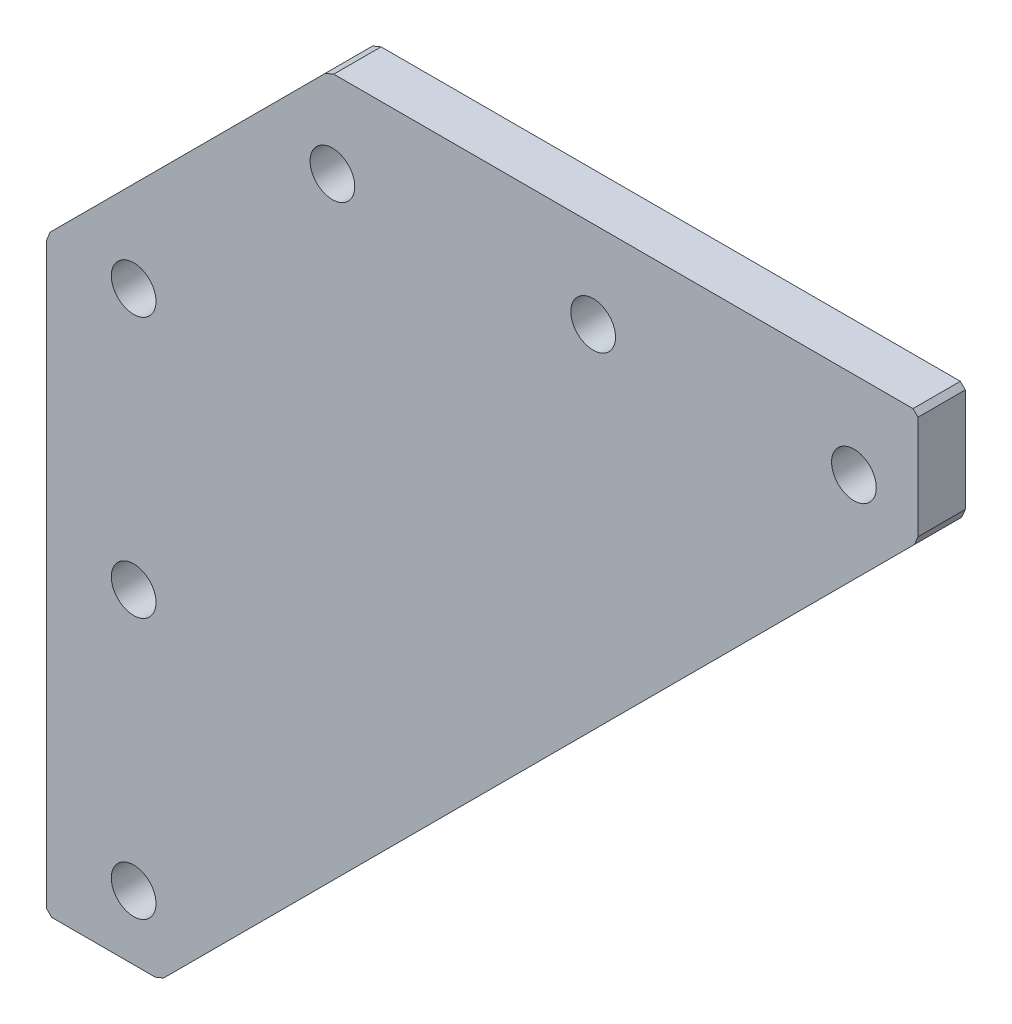
ISO-10303-21;
HEADER;
FILE_DESCRIPTION(('STEP AP214'),'2;1');
FILE_NAME('part.step','',(''),(''),'','','');
FILE_SCHEMA(('AUTOMOTIVE_DESIGN { 1 0 10303 214 1 1 1 1 }'));
ENDSEC;
DATA;
#1=APPLICATION_CONTEXT('core data for automotive mechanical design processes');
#2=APPLICATION_PROTOCOL_DEFINITION('international standard','automotive_design',2000,#1);
#3=PRODUCT_CONTEXT('',#1,'mechanical');
#4=PRODUCT('Part','Part','',(#3));
#5=PRODUCT_RELATED_PRODUCT_CATEGORY('part','',(#4));
#6=PRODUCT_DEFINITION_FORMATION('','',#4);
#7=PRODUCT_DEFINITION_CONTEXT('part definition',#1,'design');
#8=PRODUCT_DEFINITION('design','',#6,#7);
#9=PRODUCT_DEFINITION_SHAPE('','',#8);
#10=(LENGTH_UNIT() NAMED_UNIT(*) SI_UNIT(.MILLI.,.METRE.));
#11=(NAMED_UNIT(*) PLANE_ANGLE_UNIT() SI_UNIT($,.RADIAN.));
#12=(NAMED_UNIT(*) SI_UNIT($,.STERADIAN.) SOLID_ANGLE_UNIT());
#13=UNCERTAINTY_MEASURE_WITH_UNIT(LENGTH_MEASURE(1.E-05),#10,'distance_accuracy_value','');
#14=(GEOMETRIC_REPRESENTATION_CONTEXT(3) GLOBAL_UNCERTAINTY_ASSIGNED_CONTEXT((#13)) GLOBAL_UNIT_ASSIGNED_CONTEXT((#10,
#11,#12)) REPRESENTATION_CONTEXT('',''));
#15=CARTESIAN_POINT('',(0.,0.,0.));
#16=DIRECTION('',(0.,0.,1.));
#17=DIRECTION('',(1.,0.,0.));
#18=AXIS2_PLACEMENT_3D('',#15,#16,#17);
#19=CARTESIAN_POINT('',(157.849025766973,17.5000000000001,4.7625));
#20=DIRECTION('',(0.,-1.,0.));
#21=DIRECTION('',(1.,0.,0.));
#22=AXIS2_PLACEMENT_3D('',#19,#20,#21);
#23=PLANE('',#22);
#24=DIRECTION('',(-1.,0.,0.));
#25=VECTOR('',#24,1.);
#26=CARTESIAN_POINT('',(157.849025766973,17.5000000000001,4.7625));
#27=LINE('',#26,#25);
#28=CARTESIAN_POINT('',(156.849025766973,17.5000000000001,4.7625));
#29=VERTEX_POINT('',#28);
#30=CARTESIAN_POINT('',(40.2677669529665,17.5000000000001,4.7625));
#31=VERTEX_POINT('',#30);
#32=EDGE_CURVE('E146',#29,#31,#27,.T.);
#33=ORIENTED_EDGE('',*,*,#32,.F.);
#34=DIRECTION('',(0.,0.,-1.));
#35=VECTOR('',#34,1.);
#36=CARTESIAN_POINT('',(156.849025766973,17.5000000000001,4.7625));
#37=LINE('',#36,#35);
#38=CARTESIAN_POINT('',(156.849025766973,17.5000000000001,-4.7625));
#39=VERTEX_POINT('',#38);
#40=EDGE_CURVE('E131',#29,#39,#37,.T.);
#41=ORIENTED_EDGE('',*,*,#40,.T.);
#42=DIRECTION('',(-1.,0.,0.));
#43=VECTOR('',#42,1.);
#44=CARTESIAN_POINT('',(157.849025766973,17.5000000000001,-4.7625));
#45=LINE('',#44,#43);
#46=CARTESIAN_POINT('',(40.2677669529665,17.5000000000001,-4.7625));
#47=VERTEX_POINT('',#46);
#48=EDGE_CURVE('E143',#39,#47,#45,.T.);
#49=ORIENTED_EDGE('',*,*,#48,.T.);
#50=DIRECTION('',(0.,0.,1.));
#51=VECTOR('',#50,1.);
#52=CARTESIAN_POINT('',(40.2677669529665,17.5000000000001,4.7625));
#53=LINE('',#52,#51);
#54=EDGE_CURVE('E148',#47,#31,#53,.T.);
#55=ORIENTED_EDGE('',*,*,#54,.T.);
#56=EDGE_LOOP('',(#33,#41,#49,#55));
#57=FACE_BOUND('',#56,.T.);
#58=ADVANCED_FACE('F36',(#57),#23,.F.);
#59=CARTESIAN_POINT('',(-17.5,-39.2677669529664,4.7625));
#60=DIRECTION('',(0.707106781186548,-0.707106781186548,0.));
#61=DIRECTION('',(0.707106781186548,0.707106781186548,0.));
#62=AXIS2_PLACEMENT_3D('',#59,#60,#61);
#63=PLANE('',#62);
#64=DIRECTION('',(-0.707106781186548,-0.707106781186548,0.));
#65=VECTOR('',#64,1.);
#66=CARTESIAN_POINT('',(-17.5,-39.2677669529664,-4.7625));
#67=LINE('',#66,#65);
#68=CARTESIAN_POINT('',(38.5606601717798,16.7928932188135,-4.7625));
#69=VERTEX_POINT('',#68);
#70=CARTESIAN_POINT('',(-16.7928932188135,-38.5606601717799,-4.7625));
#71=VERTEX_POINT('',#70);
#72=EDGE_CURVE('E152',#69,#71,#67,.T.);
#73=ORIENTED_EDGE('',*,*,#72,.T.);
#74=DIRECTION('',(0.,0.,1.));
#75=VECTOR('',#74,1.);
#76=CARTESIAN_POINT('',(-16.7928932188135,-38.5606601717799,4.7625));
#77=LINE('',#76,#75);
#78=CARTESIAN_POINT('',(-16.7928932188135,-38.5606601717799,4.7625));
#79=VERTEX_POINT('',#78);
#80=EDGE_CURVE('E11',#71,#79,#77,.T.);
#81=ORIENTED_EDGE('',*,*,#80,.T.);
#82=DIRECTION('',(-0.707106781186548,-0.707106781186548,0.));
#83=VECTOR('',#82,1.);
#84=CARTESIAN_POINT('',(-17.5,-39.2677669529664,4.7625));
#85=LINE('',#84,#83);
#86=CARTESIAN_POINT('',(38.5606601717798,16.7928932188135,4.7625));
#87=VERTEX_POINT('',#86);
#88=EDGE_CURVE('E217',#87,#79,#85,.T.);
#89=ORIENTED_EDGE('',*,*,#88,.F.);
#90=DIRECTION('',(0.,0.,-1.));
#91=VECTOR('',#90,1.);
#92=CARTESIAN_POINT('',(38.5606601717798,16.7928932188135,4.7625));
#93=LINE('',#92,#91);
#94=EDGE_CURVE('E45',#87,#69,#93,.T.);
#95=ORIENTED_EDGE('',*,*,#94,.T.);
#96=EDGE_LOOP('',(#73,#81,#89,#95));
#97=FACE_BOUND('',#96,.T.);
#98=ADVANCED_FACE('F214',(#97),#63,.F.);
#99=CARTESIAN_POINT('',(-17.5,-39.2677669529664,4.7625));
#100=DIRECTION('',(1.,0.,0.));
#101=DIRECTION('',(0.,1.,0.));
#102=AXIS2_PLACEMENT_3D('',#99,#100,#101);
#103=PLANE('',#102);
#104=DIRECTION('',(0.,-1.,0.));
#105=VECTOR('',#104,1.);
#106=CARTESIAN_POINT('',(-17.5,-39.2677669529664,-4.7625));
#107=LINE('',#106,#105);
#108=CARTESIAN_POINT('',(-17.5,-40.2677669529663,-4.7625));
#109=VERTEX_POINT('',#108);
#110=CARTESIAN_POINT('',(-17.5,-156.849025766973,-4.7625));
#111=VERTEX_POINT('',#110);
#112=EDGE_CURVE('E156',#109,#111,#107,.T.);
#113=ORIENTED_EDGE('',*,*,#112,.T.);
#114=DIRECTION('',(0.,0.,1.));
#115=VECTOR('',#114,1.);
#116=CARTESIAN_POINT('',(-17.5,-156.849025766973,4.7625));
#117=LINE('',#116,#115);
#118=CARTESIAN_POINT('',(-17.5,-156.849025766973,4.7625));
#119=VERTEX_POINT('',#118);
#120=EDGE_CURVE('E205',#111,#119,#117,.T.);
#121=ORIENTED_EDGE('',*,*,#120,.T.);
#122=DIRECTION('',(0.,-1.,0.));
#123=VECTOR('',#122,1.);
#124=CARTESIAN_POINT('',(-17.5,-39.2677669529664,4.7625));
#125=LINE('',#124,#123);
#126=CARTESIAN_POINT('',(-17.5,-40.2677669529663,4.7625));
#127=VERTEX_POINT('',#126);
#128=EDGE_CURVE('E230',#127,#119,#125,.T.);
#129=ORIENTED_EDGE('',*,*,#128,.F.);
#130=DIRECTION('',(0.,0.,-1.));
#131=VECTOR('',#130,1.);
#132=CARTESIAN_POINT('',(-17.5,-40.2677669529663,4.7625));
#133=LINE('',#132,#131);
#134=EDGE_CURVE('E202',#127,#109,#133,.T.);
#135=ORIENTED_EDGE('',*,*,#134,.T.);
#136=EDGE_LOOP('',(#113,#121,#129,#135));
#137=FACE_BOUND('',#136,.T.);
#138=ADVANCED_FACE('F227',(#137),#103,.F.);
#139=CARTESIAN_POINT('',(-17.5,-157.849025766973,4.7625));
#140=DIRECTION('',(0.,1.,0.));
#141=DIRECTION('',(-1.,0.,0.));
#142=AXIS2_PLACEMENT_3D('',#139,#140,#141);
#143=PLANE('',#142);
#144=DIRECTION('',(1.,0.,0.));
#145=VECTOR('',#144,1.);
#146=CARTESIAN_POINT('',(-17.5,-157.849025766973,4.7625));
#147=LINE('',#146,#145);
#148=CARTESIAN_POINT('',(-16.5,-157.849025766973,4.7625));
#149=VERTEX_POINT('',#148);
#150=CARTESIAN_POINT('',(4.3400974233027,-157.849025766973,4.7625));
#151=VERTEX_POINT('',#150);
#152=EDGE_CURVE('E232',#149,#151,#147,.T.);
#153=ORIENTED_EDGE('',*,*,#152,.F.);
#154=DIRECTION('',(0.,0.,-1.));
#155=VECTOR('',#154,1.);
#156=CARTESIAN_POINT('',(-16.5,-157.849025766973,4.7625));
#157=LINE('',#156,#155);
#158=CARTESIAN_POINT('',(-16.5,-157.849025766973,-4.7625));
#159=VERTEX_POINT('',#158);
#160=EDGE_CURVE('E199',#149,#159,#157,.T.);
#161=ORIENTED_EDGE('',*,*,#160,.T.);
#162=DIRECTION('',(1.,0.,0.));
#163=VECTOR('',#162,1.);
#164=CARTESIAN_POINT('',(-17.5,-157.849025766973,-4.7625));
#165=LINE('',#164,#163);
#166=CARTESIAN_POINT('',(4.3400974233027,-157.849025766973,-4.7625));
#167=VERTEX_POINT('',#166);
#168=EDGE_CURVE('E167',#159,#167,#165,.T.);
#169=ORIENTED_EDGE('',*,*,#168,.T.);
#170=DIRECTION('',(0.,0.,1.));
#171=VECTOR('',#170,1.);
#172=CARTESIAN_POINT('',(4.3400974233027,-157.849025766973,4.7625));
#173=LINE('',#172,#171);
#174=EDGE_CURVE('E197',#167,#151,#173,.T.);
#175=ORIENTED_EDGE('',*,*,#174,.T.);
#176=EDGE_LOOP('',(#153,#161,#169,#175));
#177=FACE_BOUND('',#176,.T.);
#178=ADVANCED_FACE('F256',(#177),#143,.F.);
#179=CARTESIAN_POINT('',(5.34009742330267,-157.849025766973,4.7625));
#180=DIRECTION('',(-0.707106781186548,0.707106781186547,0.));
#181=DIRECTION('',(-0.707106781186547,-0.707106781186548,0.));
#182=AXIS2_PLACEMENT_3D('',#179,#180,#181);
#183=PLANE('',#182);
#184=DIRECTION('',(0.707106781186547,0.707106781186548,0.));
#185=VECTOR('',#184,1.);
#186=CARTESIAN_POINT('',(5.34009742330267,-157.849025766973,-4.7625));
#187=LINE('',#186,#185);
#188=CARTESIAN_POINT('',(6.04720420448925,-157.141918985787,-4.7625));
#189=VERTEX_POINT('',#188);
#190=CARTESIAN_POINT('',(157.141918985787,-6.0472042044892,-4.7625));
#191=VERTEX_POINT('',#190);
#192=EDGE_CURVE('E170',#189,#191,#187,.T.);
#193=ORIENTED_EDGE('',*,*,#192,.T.);
#194=DIRECTION('',(0.,0.,1.));
#195=VECTOR('',#194,1.);
#196=CARTESIAN_POINT('',(157.141918985787,-6.04720420448918,4.7625));
#197=LINE('',#196,#195);
#198=CARTESIAN_POINT('',(157.141918985787,-6.0472042044892,4.7625));
#199=VERTEX_POINT('',#198);
#200=EDGE_CURVE('E52',#191,#199,#197,.T.);
#201=ORIENTED_EDGE('',*,*,#200,.T.);
#202=DIRECTION('',(0.707106781186547,0.707106781186548,0.));
#203=VECTOR('',#202,1.);
#204=CARTESIAN_POINT('',(5.34009742330267,-157.849025766973,4.7625));
#205=LINE('',#204,#203);
#206=CARTESIAN_POINT('',(6.04720420448925,-157.141918985787,4.7625));
#207=VERTEX_POINT('',#206);
#208=EDGE_CURVE('E234',#207,#199,#205,.T.);
#209=ORIENTED_EDGE('',*,*,#208,.F.);
#210=DIRECTION('',(0.,0.,-1.));
#211=VECTOR('',#210,1.);
#212=CARTESIAN_POINT('',(6.04720420448925,-157.141918985787,4.7625));
#213=LINE('',#212,#211);
#214=EDGE_CURVE('E207',#207,#189,#213,.T.);
#215=ORIENTED_EDGE('',*,*,#214,.T.);
#216=EDGE_LOOP('',(#193,#201,#209,#215));
#217=FACE_BOUND('',#216,.T.);
#218=ADVANCED_FACE('F248',(#217),#183,.F.);
#219=CARTESIAN_POINT('',(157.849025766973,-5.34009742330262,4.7625));
#220=DIRECTION('',(-1.,0.,0.));
#221=DIRECTION('',(0.,-1.,0.));
#222=AXIS2_PLACEMENT_3D('',#219,#220,#221);
#223=PLANE('',#222);
#224=DIRECTION('',(0.,1.,0.));
#225=VECTOR('',#224,1.);
#226=CARTESIAN_POINT('',(157.849025766973,-5.34009742330262,-4.7625));
#227=LINE('',#226,#225);
#228=CARTESIAN_POINT('',(157.849025766973,-4.34009742330263,-4.7625));
#229=VERTEX_POINT('',#228);
#230=CARTESIAN_POINT('',(157.849025766973,16.5000000000001,-4.7625));
#231=VERTEX_POINT('',#230);
#232=EDGE_CURVE('E172',#229,#231,#227,.T.);
#233=ORIENTED_EDGE('',*,*,#232,.T.);
#234=DIRECTION('',(0.,0.,1.));
#235=VECTOR('',#234,1.);
#236=CARTESIAN_POINT('',(157.849025766973,16.5000000000001,4.7625));
#237=LINE('',#236,#235);
#238=CARTESIAN_POINT('',(157.849025766973,16.5000000000001,4.7625));
#239=VERTEX_POINT('',#238);
#240=EDGE_CURVE('E132',#231,#239,#237,.T.);
#241=ORIENTED_EDGE('',*,*,#240,.T.);
#242=DIRECTION('',(0.,1.,0.));
#243=VECTOR('',#242,1.);
#244=CARTESIAN_POINT('',(157.849025766973,-5.34009742330262,4.7625));
#245=LINE('',#244,#243);
#246=CARTESIAN_POINT('',(157.849025766973,-4.34009742330263,4.7625));
#247=VERTEX_POINT('',#246);
#248=EDGE_CURVE('E162',#247,#239,#245,.T.);
#249=ORIENTED_EDGE('',*,*,#248,.F.);
#250=DIRECTION('',(0.,0.,-1.));
#251=VECTOR('',#250,1.);
#252=CARTESIAN_POINT('',(157.849025766973,-4.34009742330263,4.7625));
#253=LINE('',#252,#251);
#254=EDGE_CURVE('E137',#247,#229,#253,.T.);
#255=ORIENTED_EDGE('',*,*,#254,.T.);
#256=EDGE_LOOP('',(#233,#241,#249,#255));
#257=FACE_BOUND('',#256,.T.);
#258=ADVANCED_FACE('F244',(#257),#223,.F.);
#259=CARTESIAN_POINT('',(0.,0.,4.7625));
#260=DIRECTION('',(0.,0.,1.));
#261=DIRECTION('',(1.,0.,0.));
#262=AXIS2_PLACEMENT_3D('',#259,#260,#261);
#263=PLANE('',#262);
#264=CARTESIAN_POINT('',(0.,-92.4784450716211,4.7625));
#265=DIRECTION('',(0.,0.,1.));
#266=DIRECTION('',(1.,0.,0.));
#267=AXIS2_PLACEMENT_3D('',#264,#265,#266);
#268=CIRCLE('',#267,4.5);
#269=CARTESIAN_POINT('',(4.5,-92.4784450716211,4.7625));
#270=VERTEX_POINT('',#269);
#271=EDGE_CURVE('E471',#270,#270,#268,.T.);
#272=ORIENTED_EDGE('',*,*,#271,.F.);
#273=EDGE_LOOP('',(#272));
#274=FACE_BOUND('',#273,.T.);
#275=CARTESIAN_POINT('',(144.956890143242,0.,4.7625));
#276=DIRECTION('',(0.,0.,1.));
#277=DIRECTION('',(1.,0.,0.));
#278=AXIS2_PLACEMENT_3D('',#275,#276,#277);
#279=CIRCLE('',#278,4.5);
#280=CARTESIAN_POINT('',(149.456890143242,0.,4.7625));
#281=VERTEX_POINT('',#280);
#282=EDGE_CURVE('E465',#281,#281,#279,.T.);
#283=ORIENTED_EDGE('',*,*,#282,.F.);
#284=EDGE_LOOP('',(#283));
#285=FACE_BOUND('',#284,.T.);
#286=CARTESIAN_POINT('',(92.4784450716211,0.,4.7625));
#287=DIRECTION('',(0.,0.,1.));
#288=DIRECTION('',(1.,0.,0.));
#289=AXIS2_PLACEMENT_3D('',#286,#287,#288);
#290=CIRCLE('',#289,4.5);
#291=CARTESIAN_POINT('',(96.9784450716211,0.,4.7625));
#292=VERTEX_POINT('',#291);
#293=EDGE_CURVE('E459',#292,#292,#290,.T.);
#294=ORIENTED_EDGE('',*,*,#293,.F.);
#295=EDGE_LOOP('',(#294));
#296=FACE_BOUND('',#295,.T.);
#297=CARTESIAN_POINT('',(0.,-40.,4.7625));
#298=DIRECTION('',(0.,0.,1.));
#299=DIRECTION('',(1.,0.,0.));
#300=AXIS2_PLACEMENT_3D('',#297,#298,#299);
#301=CIRCLE('',#300,4.5);
#302=CARTESIAN_POINT('',(4.5,-40.,4.7625));
#303=VERTEX_POINT('',#302);
#304=EDGE_CURVE('E453',#303,#303,#301,.T.);
#305=ORIENTED_EDGE('',*,*,#304,.F.);
#306=EDGE_LOOP('',(#305));
#307=FACE_BOUND('',#306,.T.);
#308=CARTESIAN_POINT('',(0.,-144.956890143242,4.7625));
#309=DIRECTION('',(0.,0.,1.));
#310=DIRECTION('',(1.,0.,0.));
#311=AXIS2_PLACEMENT_3D('',#308,#309,#310);
#312=CIRCLE('',#311,4.5);
#313=CARTESIAN_POINT('',(4.5,-144.956890143242,4.7625));
#314=VERTEX_POINT('',#313);
#315=EDGE_CURVE('E445',#314,#314,#312,.T.);
#316=ORIENTED_EDGE('',*,*,#315,.F.);
#317=EDGE_LOOP('',(#316));
#318=FACE_BOUND('',#317,.T.);
#319=CARTESIAN_POINT('',(40.,0.,4.7625));
#320=DIRECTION('',(0.,0.,1.));
#321=DIRECTION('',(1.,0.,0.));
#322=AXIS2_PLACEMENT_3D('',#319,#320,#321);
#323=CIRCLE('',#322,4.5);
#324=CARTESIAN_POINT('',(44.5,0.,4.7625));
#325=VERTEX_POINT('',#324);
#326=EDGE_CURVE('E159',#325,#325,#323,.T.);
#327=ORIENTED_EDGE('',*,*,#326,.F.);
#328=EDGE_LOOP('',(#327));
#329=FACE_BOUND('',#328,.T.);
#330=ORIENTED_EDGE('',*,*,#248,.T.);
#331=DIRECTION('',(0.707106781186548,-0.707106781186548,0.));
#332=VECTOR('',#331,1.);
#333=CARTESIAN_POINT('',(87.1745128834866,87.1745128834866,4.7625));
#334=LINE('',#333,#332);
#335=EDGE_CURVE('E195',#239,#29,#334,.F.);
#336=ORIENTED_EDGE('',*,*,#335,.T.);
#337=ORIENTED_EDGE('',*,*,#32,.T.);
#338=DIRECTION('',(0.923879532511287,0.382683432365091,0.));
#339=VECTOR('',#338,1.);
#340=CARTESIAN_POINT('',(-0.290106396740138,0.700378797541229,4.7625));
#341=LINE('',#340,#339);
#342=EDGE_CURVE('E186',#31,#87,#341,.F.);
#343=ORIENTED_EDGE('',*,*,#342,.T.);
#344=ORIENTED_EDGE('',*,*,#88,.T.);
#345=DIRECTION('',(0.382683432365091,0.923879532511286,0.));
#346=VECTOR('',#345,1.);
#347=CARTESIAN_POINT('',(-0.700378797541232,0.29010639674014,4.7625));
#348=LINE('',#347,#346);
#349=EDGE_CURVE('E188',#79,#127,#348,.F.);
#350=ORIENTED_EDGE('',*,*,#349,.T.);
#351=ORIENTED_EDGE('',*,*,#128,.T.);
#352=DIRECTION('',(-0.707106781186548,0.707106781186548,0.));
#353=VECTOR('',#352,1.);
#354=CARTESIAN_POINT('',(-87.1745128834866,-87.1745128834866,4.7625));
#355=LINE('',#354,#353);
#356=EDGE_CURVE('E193',#119,#149,#355,.F.);
#357=ORIENTED_EDGE('',*,*,#356,.T.);
#358=ORIENTED_EDGE('',*,*,#152,.T.);
#359=DIRECTION('',(-0.923879532511283,-0.3826834323651,0.));
#360=VECTOR('',#359,1.);
#361=CARTESIAN_POINT('',(56.4436508138972,-136.267027304758,4.7625));
#362=LINE('',#361,#360);
#363=EDGE_CURVE('E59',#151,#207,#362,.F.);
#364=ORIENTED_EDGE('',*,*,#363,.T.);
#365=ORIENTED_EDGE('',*,*,#208,.T.);
#366=DIRECTION('',(-0.382683432365088,-0.923879532511288,0.));
#367=VECTOR('',#366,1.);
#368=CARTESIAN_POINT('',(136.267027304759,-56.4436508138957,4.7625));
#369=LINE('',#368,#367);
#370=EDGE_CURVE('E191',#199,#247,#369,.F.);
#371=ORIENTED_EDGE('',*,*,#370,.T.);
#372=EDGE_LOOP('',(#330,#336,#337,#343,#344,#350,#351,#357,#358,#364,#365,#371));
#373=FACE_BOUND('',#372,.T.);
#374=ADVANCED_FACE('F241',(#274,#285,#296,#307,#318,#329,#373),#263,.T.);
#375=CARTESIAN_POINT('',(0.,0.,-4.7625));
#376=DIRECTION('',(0.,0.,1.));
#377=DIRECTION('',(1.,0.,0.));
#378=AXIS2_PLACEMENT_3D('',#375,#376,#377);
#379=PLANE('',#378);
#380=CARTESIAN_POINT('',(0.,-92.4784450716211,-4.7625));
#381=DIRECTION('',(0.,0.,1.));
#382=DIRECTION('',(1.,0.,0.));
#383=AXIS2_PLACEMENT_3D('',#380,#381,#382);
#384=CIRCLE('',#383,4.5);
#385=CARTESIAN_POINT('',(4.5,-92.4784450716211,-4.7625));
#386=VERTEX_POINT('',#385);
#387=EDGE_CURVE('E468',#386,#386,#384,.T.);
#388=ORIENTED_EDGE('',*,*,#387,.T.);
#389=EDGE_LOOP('',(#388));
#390=FACE_BOUND('',#389,.T.);
#391=CARTESIAN_POINT('',(144.956890143242,0.,-4.7625));
#392=DIRECTION('',(0.,0.,1.));
#393=DIRECTION('',(1.,0.,0.));
#394=AXIS2_PLACEMENT_3D('',#391,#392,#393);
#395=CIRCLE('',#394,4.5);
#396=CARTESIAN_POINT('',(149.456890143242,0.,-4.7625));
#397=VERTEX_POINT('',#396);
#398=EDGE_CURVE('E462',#397,#397,#395,.T.);
#399=ORIENTED_EDGE('',*,*,#398,.T.);
#400=EDGE_LOOP('',(#399));
#401=FACE_BOUND('',#400,.T.);
#402=CARTESIAN_POINT('',(92.4784450716211,0.,-4.7625));
#403=DIRECTION('',(0.,0.,1.));
#404=DIRECTION('',(1.,0.,0.));
#405=AXIS2_PLACEMENT_3D('',#402,#403,#404);
#406=CIRCLE('',#405,4.5);
#407=CARTESIAN_POINT('',(96.9784450716211,0.,-4.7625));
#408=VERTEX_POINT('',#407);
#409=EDGE_CURVE('E456',#408,#408,#406,.T.);
#410=ORIENTED_EDGE('',*,*,#409,.T.);
#411=EDGE_LOOP('',(#410));
#412=FACE_BOUND('',#411,.T.);
#413=CARTESIAN_POINT('',(0.,-40.,-4.7625));
#414=DIRECTION('',(0.,0.,1.));
#415=DIRECTION('',(1.,0.,0.));
#416=AXIS2_PLACEMENT_3D('',#413,#414,#415);
#417=CIRCLE('',#416,4.5);
#418=CARTESIAN_POINT('',(4.5,-40.,-4.7625));
#419=VERTEX_POINT('',#418);
#420=EDGE_CURVE('E450',#419,#419,#417,.T.);
#421=ORIENTED_EDGE('',*,*,#420,.T.);
#422=EDGE_LOOP('',(#421));
#423=FACE_BOUND('',#422,.T.);
#424=CARTESIAN_POINT('',(0.,-144.956890143242,-4.7625));
#425=DIRECTION('',(0.,0.,1.));
#426=DIRECTION('',(1.,0.,0.));
#427=AXIS2_PLACEMENT_3D('',#424,#425,#426);
#428=CIRCLE('',#427,4.5);
#429=CARTESIAN_POINT('',(4.5,-144.956890143242,-4.7625));
#430=VERTEX_POINT('',#429);
#431=EDGE_CURVE('E442',#430,#430,#428,.T.);
#432=ORIENTED_EDGE('',*,*,#431,.T.);
#433=EDGE_LOOP('',(#432));
#434=FACE_BOUND('',#433,.T.);
#435=CARTESIAN_POINT('',(40.,0.,-4.7625));
#436=DIRECTION('',(0.,0.,1.));
#437=DIRECTION('',(1.,0.,0.));
#438=AXIS2_PLACEMENT_3D('',#435,#436,#437);
#439=CIRCLE('',#438,4.5);
#440=CARTESIAN_POINT('',(44.5,0.,-4.7625));
#441=VERTEX_POINT('',#440);
#442=EDGE_CURVE('E153',#441,#441,#439,.T.);
#443=ORIENTED_EDGE('',*,*,#442,.T.);
#444=EDGE_LOOP('',(#443));
#445=FACE_BOUND('',#444,.T.);
#446=ORIENTED_EDGE('',*,*,#48,.F.);
#447=DIRECTION('',(-0.707106781186548,0.707106781186548,0.));
#448=VECTOR('',#447,1.);
#449=CARTESIAN_POINT('',(156.849025766973,17.5000000000001,-4.7625));
#450=LINE('',#449,#448);
#451=EDGE_CURVE('E127',#39,#231,#450,.F.);
#452=ORIENTED_EDGE('',*,*,#451,.T.);
#453=ORIENTED_EDGE('',*,*,#232,.F.);
#454=DIRECTION('',(0.382683432365088,0.923879532511288,0.));
#455=VECTOR('',#454,1.);
#456=CARTESIAN_POINT('',(157.849025766973,-4.34009742330263,-4.7625));
#457=LINE('',#456,#455);
#458=EDGE_CURVE('E180',#229,#191,#457,.F.);
#459=ORIENTED_EDGE('',*,*,#458,.T.);
#460=ORIENTED_EDGE('',*,*,#192,.F.);
#461=DIRECTION('',(0.923879532511283,0.3826834323651,0.));
#462=VECTOR('',#461,1.);
#463=CARTESIAN_POINT('',(6.04720420448924,-157.141918985787,-4.7625));
#464=LINE('',#463,#462);
#465=EDGE_CURVE('E178',#189,#167,#464,.F.);
#466=ORIENTED_EDGE('',*,*,#465,.T.);
#467=ORIENTED_EDGE('',*,*,#168,.F.);
#468=DIRECTION('',(0.707106781186548,-0.707106781186548,0.));
#469=VECTOR('',#468,1.);
#470=CARTESIAN_POINT('',(-16.5,-157.849025766973,-4.7625));
#471=LINE('',#470,#469);
#472=EDGE_CURVE('E138',#159,#111,#471,.F.);
#473=ORIENTED_EDGE('',*,*,#472,.T.);
#474=ORIENTED_EDGE('',*,*,#112,.F.);
#475=DIRECTION('',(-0.382683432365091,-0.923879532511286,0.));
#476=VECTOR('',#475,1.);
#477=CARTESIAN_POINT('',(-17.5,-40.2677669529663,-4.7625));
#478=LINE('',#477,#476);
#479=EDGE_CURVE('E176',#109,#71,#478,.F.);
#480=ORIENTED_EDGE('',*,*,#479,.T.);
#481=ORIENTED_EDGE('',*,*,#72,.F.);
#482=DIRECTION('',(-0.923879532511287,-0.382683432365091,0.));
#483=VECTOR('',#482,1.);
#484=CARTESIAN_POINT('',(38.5606601717798,16.7928932188135,-4.7625));
#485=LINE('',#484,#483);
#486=EDGE_CURVE('E147',#69,#47,#485,.F.);
#487=ORIENTED_EDGE('',*,*,#486,.T.);
#488=EDGE_LOOP('',(#446,#452,#453,#459,#460,#466,#467,#473,#474,#480,#481,#487));
#489=FACE_BOUND('',#488,.T.);
#490=ADVANCED_FACE('F150',(#390,#401,#412,#423,#434,#445,#489),#379,.F.);
#491=CARTESIAN_POINT('',(40.,0.,4.7625));
#492=DIRECTION('',(0.,0.,1.));
#493=DIRECTION('',(1.,0.,0.));
#494=AXIS2_PLACEMENT_3D('',#491,#492,#493);
#495=CYLINDRICAL_SURFACE('',#494,4.5);
#496=ORIENTED_EDGE('',*,*,#442,.F.);
#497=EDGE_LOOP('',(#496));
#498=FACE_BOUND('',#497,.T.);
#499=ORIENTED_EDGE('',*,*,#326,.T.);
#500=EDGE_LOOP('',(#499));
#501=FACE_BOUND('',#500,.T.);
#502=ADVANCED_FACE('F326',(#498,#501),#495,.F.);
#503=CARTESIAN_POINT('',(0.,-144.956890143242,4.7625));
#504=DIRECTION('',(0.,0.,1.));
#505=DIRECTION('',(1.,0.,0.));
#506=AXIS2_PLACEMENT_3D('',#503,#504,#505);
#507=CYLINDRICAL_SURFACE('',#506,4.5);
#508=ORIENTED_EDGE('',*,*,#431,.F.);
#509=EDGE_LOOP('',(#508));
#510=FACE_BOUND('',#509,.T.);
#511=ORIENTED_EDGE('',*,*,#315,.T.);
#512=EDGE_LOOP('',(#511));
#513=FACE_BOUND('',#512,.T.);
#514=ADVANCED_FACE('F416',(#510,#513),#507,.F.);
#515=CARTESIAN_POINT('',(0.,-40.,4.7625));
#516=DIRECTION('',(0.,0.,1.));
#517=DIRECTION('',(1.,0.,0.));
#518=AXIS2_PLACEMENT_3D('',#515,#516,#517);
#519=CYLINDRICAL_SURFACE('',#518,4.5);
#520=ORIENTED_EDGE('',*,*,#420,.F.);
#521=EDGE_LOOP('',(#520));
#522=FACE_BOUND('',#521,.T.);
#523=ORIENTED_EDGE('',*,*,#304,.T.);
#524=EDGE_LOOP('',(#523));
#525=FACE_BOUND('',#524,.T.);
#526=ADVANCED_FACE('F406',(#522,#525),#519,.F.);
#527=CARTESIAN_POINT('',(92.4784450716211,0.,4.7625));
#528=DIRECTION('',(0.,0.,1.));
#529=DIRECTION('',(1.,0.,0.));
#530=AXIS2_PLACEMENT_3D('',#527,#528,#529);
#531=CYLINDRICAL_SURFACE('',#530,4.5);
#532=ORIENTED_EDGE('',*,*,#409,.F.);
#533=EDGE_LOOP('',(#532));
#534=FACE_BOUND('',#533,.T.);
#535=ORIENTED_EDGE('',*,*,#293,.T.);
#536=EDGE_LOOP('',(#535));
#537=FACE_BOUND('',#536,.T.);
#538=ADVANCED_FACE('F396',(#534,#537),#531,.F.);
#539=CARTESIAN_POINT('',(144.956890143242,0.,4.7625));
#540=DIRECTION('',(0.,0.,1.));
#541=DIRECTION('',(1.,0.,0.));
#542=AXIS2_PLACEMENT_3D('',#539,#540,#541);
#543=CYLINDRICAL_SURFACE('',#542,4.5);
#544=ORIENTED_EDGE('',*,*,#398,.F.);
#545=EDGE_LOOP('',(#544));
#546=FACE_BOUND('',#545,.T.);
#547=ORIENTED_EDGE('',*,*,#282,.T.);
#548=EDGE_LOOP('',(#547));
#549=FACE_BOUND('',#548,.T.);
#550=ADVANCED_FACE('F386',(#546,#549),#543,.F.);
#551=CARTESIAN_POINT('',(0.,-92.4784450716211,4.7625));
#552=DIRECTION('',(0.,0.,1.));
#553=DIRECTION('',(1.,0.,0.));
#554=AXIS2_PLACEMENT_3D('',#551,#552,#553);
#555=CYLINDRICAL_SURFACE('',#554,4.5);
#556=ORIENTED_EDGE('',*,*,#387,.F.);
#557=EDGE_LOOP('',(#556));
#558=FACE_BOUND('',#557,.T.);
#559=ORIENTED_EDGE('',*,*,#271,.T.);
#560=EDGE_LOOP('',(#559));
#561=FACE_BOUND('',#560,.T.);
#562=ADVANCED_FACE('F267',(#558,#561),#555,.F.);
#563=CARTESIAN_POINT('',(156.849025766973,17.5000000000001,4.7625));
#564=DIRECTION('',(-0.707106781186547,-0.707106781186547,0.));
#565=DIRECTION('',(0.,0.,-1.));
#566=AXIS2_PLACEMENT_3D('',#563,#564,#565);
#567=PLANE('',#566);
#568=ORIENTED_EDGE('',*,*,#335,.F.);
#569=ORIENTED_EDGE('',*,*,#240,.F.);
#570=ORIENTED_EDGE('',*,*,#451,.F.);
#571=ORIENTED_EDGE('',*,*,#40,.F.);
#572=EDGE_LOOP('',(#568,#569,#570,#571));
#573=FACE_BOUND('',#572,.T.);
#574=ADVANCED_FACE('F130',(#573),#567,.F.);
#575=CARTESIAN_POINT('',(-16.5,-157.849025766973,4.7625));
#576=DIRECTION('',(0.707106781186547,0.707106781186547,0.));
#577=DIRECTION('',(0.,0.,-1.));
#578=AXIS2_PLACEMENT_3D('',#575,#576,#577);
#579=PLANE('',#578);
#580=ORIENTED_EDGE('',*,*,#356,.F.);
#581=ORIENTED_EDGE('',*,*,#120,.F.);
#582=ORIENTED_EDGE('',*,*,#472,.F.);
#583=ORIENTED_EDGE('',*,*,#160,.F.);
#584=EDGE_LOOP('',(#580,#581,#582,#583));
#585=FACE_BOUND('',#584,.T.);
#586=ADVANCED_FACE('F259',(#585),#579,.F.);
#587=CARTESIAN_POINT('',(157.849025766973,-4.34009742330263,4.7625));
#588=DIRECTION('',(-0.923879532511288,0.382683432365088,0.));
#589=DIRECTION('',(0.,0.,-1.));
#590=AXIS2_PLACEMENT_3D('',#587,#588,#589);
#591=PLANE('',#590);
#592=ORIENTED_EDGE('',*,*,#370,.F.);
#593=ORIENTED_EDGE('',*,*,#200,.F.);
#594=ORIENTED_EDGE('',*,*,#458,.F.);
#595=ORIENTED_EDGE('',*,*,#254,.F.);
#596=EDGE_LOOP('',(#592,#593,#594,#595));
#597=FACE_BOUND('',#596,.T.);
#598=ADVANCED_FACE('F246',(#597),#591,.F.);
#599=CARTESIAN_POINT('',(6.04720420448924,-157.141918985787,4.7625));
#600=DIRECTION('',(-0.3826834323651,0.923879532511283,0.));
#601=DIRECTION('',(0.,0.,-1.));
#602=AXIS2_PLACEMENT_3D('',#599,#600,#601);
#603=PLANE('',#602);
#604=ORIENTED_EDGE('',*,*,#363,.F.);
#605=ORIENTED_EDGE('',*,*,#174,.F.);
#606=ORIENTED_EDGE('',*,*,#465,.F.);
#607=ORIENTED_EDGE('',*,*,#214,.F.);
#608=EDGE_LOOP('',(#604,#605,#606,#607));
#609=FACE_BOUND('',#608,.T.);
#610=ADVANCED_FACE('F251',(#609),#603,.F.);
#611=CARTESIAN_POINT('',(-17.5,-40.2677669529663,4.7625));
#612=DIRECTION('',(0.923879532511286,-0.382683432365091,0.));
#613=DIRECTION('',(0.,0.,-1.));
#614=AXIS2_PLACEMENT_3D('',#611,#612,#613);
#615=PLANE('',#614);
#616=ORIENTED_EDGE('',*,*,#349,.F.);
#617=ORIENTED_EDGE('',*,*,#80,.F.);
#618=ORIENTED_EDGE('',*,*,#479,.F.);
#619=ORIENTED_EDGE('',*,*,#134,.F.);
#620=EDGE_LOOP('',(#616,#617,#618,#619));
#621=FACE_BOUND('',#620,.T.);
#622=ADVANCED_FACE('F224',(#621),#615,.F.);
#623=CARTESIAN_POINT('',(38.5606601717798,16.7928932188135,4.7625));
#624=DIRECTION('',(0.382683432365091,-0.923879532511286,0.));
#625=DIRECTION('',(0.,0.,-1.));
#626=AXIS2_PLACEMENT_3D('',#623,#624,#625);
#627=PLANE('',#626);
#628=ORIENTED_EDGE('',*,*,#342,.F.);
#629=ORIENTED_EDGE('',*,*,#54,.F.);
#630=ORIENTED_EDGE('',*,*,#486,.F.);
#631=ORIENTED_EDGE('',*,*,#94,.F.);
#632=EDGE_LOOP('',(#628,#629,#630,#631));
#633=FACE_BOUND('',#632,.T.);
#634=ADVANCED_FACE('F39',(#633),#627,.F.);
#635=CLOSED_SHELL('',(#58,#98,#138,#178,#218,#258,#374,#490,#502,#514,#526,#538,#550,#562,#574,
#586,#598,#610,#622,#634));
#636=MANIFOLD_SOLID_BREP('B2',#635);
#637=ADVANCED_BREP_SHAPE_REPRESENTATION('',(#18,#636),#14);
#638=SHAPE_DEFINITION_REPRESENTATION(#9,#637);
ENDSEC;
END-ISO-10303-21;
